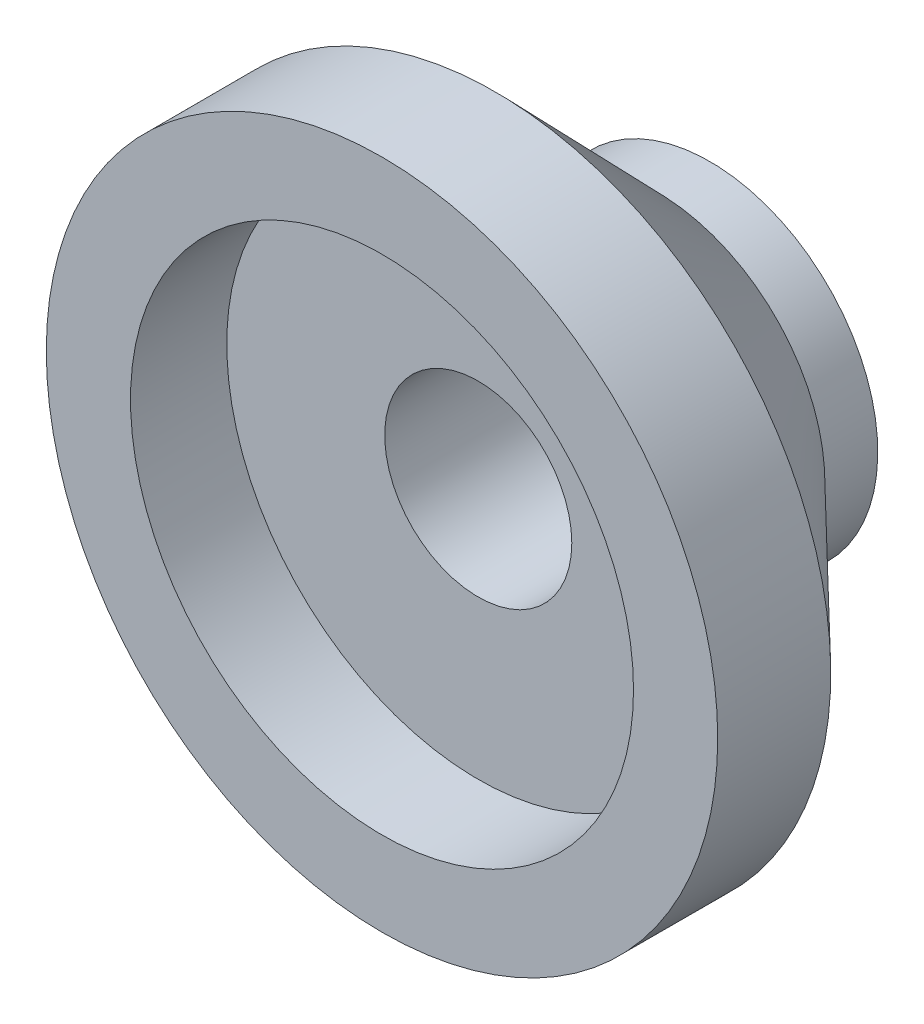
ISO-10303-21;
HEADER;
FILE_DESCRIPTION(('STEP AP214'),'2;1');
FILE_NAME('part.step','',(''),(''),'','','');
FILE_SCHEMA(('AUTOMOTIVE_DESIGN { 1 0 10303 214 1 1 1 1 }'));
ENDSEC;
DATA;
#1=APPLICATION_CONTEXT('core data for automotive mechanical design processes');
#2=APPLICATION_PROTOCOL_DEFINITION('international standard','automotive_design',2000,#1);
#3=PRODUCT_CONTEXT('',#1,'mechanical');
#4=PRODUCT('Part','Part','',(#3));
#5=PRODUCT_RELATED_PRODUCT_CATEGORY('part','',(#4));
#6=PRODUCT_DEFINITION_FORMATION('','',#4);
#7=PRODUCT_DEFINITION_CONTEXT('part definition',#1,'design');
#8=PRODUCT_DEFINITION('design','',#6,#7);
#9=PRODUCT_DEFINITION_SHAPE('','',#8);
#10=(LENGTH_UNIT() NAMED_UNIT(*) SI_UNIT(.MILLI.,.METRE.));
#11=(NAMED_UNIT(*) PLANE_ANGLE_UNIT() SI_UNIT($,.RADIAN.));
#12=(NAMED_UNIT(*) SI_UNIT($,.STERADIAN.) SOLID_ANGLE_UNIT());
#13=UNCERTAINTY_MEASURE_WITH_UNIT(LENGTH_MEASURE(1.E-05),#10,'distance_accuracy_value','');
#14=(GEOMETRIC_REPRESENTATION_CONTEXT(3) GLOBAL_UNCERTAINTY_ASSIGNED_CONTEXT((#13)) GLOBAL_UNIT_ASSIGNED_CONTEXT((#10,
#11,#12)) REPRESENTATION_CONTEXT('',''));
#15=CARTESIAN_POINT('',(0.,0.,0.));
#16=DIRECTION('',(0.,0.,1.));
#17=DIRECTION('',(1.,0.,0.));
#18=AXIS2_PLACEMENT_3D('',#15,#16,#17);
#19=CARTESIAN_POINT('',(0.,0.,3.641));
#20=DIRECTION('',(0.,0.,-1.));
#21=DIRECTION('',(-1.,0.,0.));
#22=AXIS2_PLACEMENT_3D('',#19,#20,#21);
#23=CYLINDRICAL_SURFACE('',#22,9.5143);
#24=CARTESIAN_POINT('',(0.,0.,0.));
#25=DIRECTION('',(0.,0.,1.));
#26=DIRECTION('',(1.,0.,0.));
#27=AXIS2_PLACEMENT_3D('',#24,#25,#26);
#28=CIRCLE('',#27,9.5143);
#29=CARTESIAN_POINT('',(9.5143,0.,0.));
#30=VERTEX_POINT('',#29);
#31=EDGE_CURVE('E18',#30,#30,#28,.T.);
#32=ORIENTED_EDGE('',*,*,#31,.F.);
#33=EDGE_LOOP('',(#32));
#34=FACE_BOUND('',#33,.T.);
#35=CARTESIAN_POINT('',(0.,0.,3.641));
#36=DIRECTION('',(0.,0.,1.));
#37=DIRECTION('',(1.,0.,0.));
#38=AXIS2_PLACEMENT_3D('',#35,#36,#37);
#39=CIRCLE('',#38,9.5143);
#40=CARTESIAN_POINT('',(9.5143,0.,3.641));
#41=VERTEX_POINT('',#40);
#42=EDGE_CURVE('E10',#41,#41,#39,.T.);
#43=ORIENTED_EDGE('',*,*,#42,.T.);
#44=EDGE_LOOP('',(#43));
#45=FACE_BOUND('',#44,.T.);
#46=ADVANCED_FACE('F15',(#34,#45),#23,.F.);
#47=CARTESIAN_POINT('',(0.,0.,3.641));
#48=DIRECTION('',(0.,0.,1.));
#49=DIRECTION('',(1.,0.,0.));
#50=AXIS2_PLACEMENT_3D('',#47,#48,#49);
#51=PLANE('',#50);
#52=ORIENTED_EDGE('',*,*,#42,.F.);
#53=EDGE_LOOP('',(#52));
#54=FACE_BOUND('',#53,.T.);
#55=CARTESIAN_POINT('',(0.,0.,3.641));
#56=DIRECTION('',(0.,0.,-1.));
#57=DIRECTION('',(1.,0.,0.));
#58=AXIS2_PLACEMENT_3D('',#55,#56,#57);
#59=CIRCLE('',#58,12.7);
#60=CARTESIAN_POINT('',(12.7,0.,3.641));
#61=VERTEX_POINT('',#60);
#62=EDGE_CURVE('E36',#61,#61,#59,.T.);
#63=ORIENTED_EDGE('',*,*,#62,.F.);
#64=EDGE_LOOP('',(#63));
#65=FACE_BOUND('',#64,.T.);
#66=ADVANCED_FACE('F81',(#54,#65),#51,.T.);
#67=CARTESIAN_POINT('',(0.,0.,0.));
#68=DIRECTION('',(0.,0.,-1.));
#69=DIRECTION('',(1.,0.,0.));
#70=AXIS2_PLACEMENT_3D('',#67,#68,#69);
#71=PLANE('',#70);
#72=CARTESIAN_POINT('',(1.0993810029003E-12,-1.00180280737661E-12,0.));
#73=DIRECTION('',(0.,0.,-1.));
#74=DIRECTION('',(1.,0.,0.));
#75=AXIS2_PLACEMENT_3D('',#72,#73,#74);
#76=CIRCLE('',#75,3.53891100499998);
#77=CARTESIAN_POINT('',(3.53891100500108,-1.00180280737661E-12,0.));
#78=VERTEX_POINT('',#77);
#79=EDGE_CURVE('E30',#78,#78,#76,.T.);
#80=ORIENTED_EDGE('',*,*,#79,.T.);
#81=EDGE_LOOP('',(#80));
#82=FACE_BOUND('',#81,.T.);
#83=ORIENTED_EDGE('',*,*,#31,.T.);
#84=EDGE_LOOP('',(#83));
#85=FACE_BOUND('',#84,.T.);
#86=ADVANCED_FACE('F75',(#82,#85),#71,.F.);
#87=CARTESIAN_POINT('',(1.0993810029003E-12,-1.00180280737661E-12,3.641));
#88=DIRECTION('',(0.,0.,-1.));
#89=DIRECTION('',(1.,0.,0.));
#90=AXIS2_PLACEMENT_3D('',#87,#88,#89);
#91=CYLINDRICAL_SURFACE('',#90,3.53891100499998);
#92=CARTESIAN_POINT('',(1.0993810029003E-12,-1.00180280737661E-12,-8.763));
#93=DIRECTION('',(0.,0.,-1.));
#94=DIRECTION('',(1.,0.,0.));
#95=AXIS2_PLACEMENT_3D('',#92,#93,#94);
#96=CIRCLE('',#95,3.53891100499998);
#97=CARTESIAN_POINT('',(3.53891100500108,-1.00180280737661E-12,-8.763));
#98=VERTEX_POINT('',#97);
#99=EDGE_CURVE('E32',#98,#98,#96,.T.);
#100=ORIENTED_EDGE('',*,*,#99,.T.);
#101=EDGE_LOOP('',(#100));
#102=FACE_BOUND('',#101,.T.);
#103=ORIENTED_EDGE('',*,*,#79,.F.);
#104=EDGE_LOOP('',(#103));
#105=FACE_BOUND('',#104,.T.);
#106=ADVANCED_FACE('F66',(#102,#105),#91,.F.);
#107=CARTESIAN_POINT('',(0.,0.,-8.763));
#108=DIRECTION('',(0.,0.,-1.));
#109=DIRECTION('',(1.,0.,0.));
#110=AXIS2_PLACEMENT_3D('',#107,#108,#109);
#111=PLANE('',#110);
#112=ORIENTED_EDGE('',*,*,#99,.F.);
#113=EDGE_LOOP('',(#112));
#114=FACE_BOUND('',#113,.T.);
#115=CARTESIAN_POINT('',(0.,0.,-8.763));
#116=DIRECTION('',(0.,0.,1.));
#117=DIRECTION('',(0.,-1.,0.));
#118=AXIS2_PLACEMENT_3D('',#115,#116,#117);
#119=CIRCLE('',#118,6.35);
#120=CARTESIAN_POINT('',(0.,-6.35,-8.763));
#121=VERTEX_POINT('',#120);
#122=EDGE_CURVE('E40',#121,#121,#119,.T.);
#123=ORIENTED_EDGE('',*,*,#122,.F.);
#124=EDGE_LOOP('',(#123));
#125=FACE_BOUND('',#124,.T.);
#126=ADVANCED_FACE('F64',(#114,#125),#111,.T.);
#127=CARTESIAN_POINT('',(0.,0.,0.));
#128=DIRECTION('',(0.,0.,1.));
#129=DIRECTION('',(-1.,0.,0.));
#130=AXIS2_PLACEMENT_3D('',#127,#128,#129);
#131=CYLINDRICAL_SURFACE('',#130,12.7);
#132=ORIENTED_EDGE('',*,*,#62,.T.);
#133=EDGE_LOOP('',(#132));
#134=FACE_BOUND('',#133,.T.);
#135=CARTESIAN_POINT('',(0.,0.,-0.635));
#136=DIRECTION('',(0.,0.,1.));
#137=DIRECTION('',(0.,-1.,0.));
#138=AXIS2_PLACEMENT_3D('',#135,#136,#137);
#139=CIRCLE('',#138,12.7);
#140=CARTESIAN_POINT('',(0.,-12.7,-0.635000000000002));
#141=VERTEX_POINT('',#140);
#142=EDGE_CURVE('E43',#141,#141,#139,.T.);
#143=ORIENTED_EDGE('',*,*,#142,.T.);
#144=EDGE_LOOP('',(#143));
#145=FACE_BOUND('',#144,.T.);
#146=ADVANCED_FACE('F60',(#134,#145),#131,.T.);
#147=CARTESIAN_POINT('',(0.,0.,1.8205));
#148=DIRECTION('',(0.,0.,1.));
#149=DIRECTION('',(0.,-1.,0.));
#150=AXIS2_PLACEMENT_3D('',#147,#148,#149);
#151=CYLINDRICAL_SURFACE('',#150,6.35);
#152=CARTESIAN_POINT('',(0.,0.,-6.763));
#153=DIRECTION('',(0.,0.,1.));
#154=DIRECTION('',(0.,-1.,0.));
#155=AXIS2_PLACEMENT_3D('',#152,#153,#154);
#156=CIRCLE('',#155,6.35);
#157=CARTESIAN_POINT('',(0.,-6.35,-6.763));
#158=VERTEX_POINT('',#157);
#159=EDGE_CURVE('E49',#158,#158,#156,.T.);
#160=ORIENTED_EDGE('',*,*,#159,.F.);
#161=EDGE_LOOP('',(#160));
#162=FACE_BOUND('',#161,.T.);
#163=ORIENTED_EDGE('',*,*,#122,.T.);
#164=EDGE_LOOP('',(#163));
#165=FACE_BOUND('',#164,.T.);
#166=ADVANCED_FACE('F57',(#162,#165),#151,.T.);
#167=CARTESIAN_POINT('',(0.,0.,-0.635));
#168=DIRECTION('',(0.,0.,1.));
#169=DIRECTION('',(0.,-1.,0.));
#170=AXIS2_PLACEMENT_3D('',#167,#168,#169);
#171=CONICAL_SURFACE('',#170,12.7,0.803187599298051);
#172=ORIENTED_EDGE('',*,*,#142,.F.);
#173=EDGE_LOOP('',(#172));
#174=FACE_BOUND('',#173,.T.);
#175=ORIENTED_EDGE('',*,*,#159,.T.);
#176=EDGE_LOOP('',(#175));
#177=FACE_BOUND('',#176,.T.);
#178=ADVANCED_FACE('F55',(#174,#177),#171,.T.);
#179=CLOSED_SHELL('',(#46,#66,#86,#106,#126,#146,#166,#178));
#180=MANIFOLD_SOLID_BREP('B1',#179);
#181=ADVANCED_BREP_SHAPE_REPRESENTATION('',(#18,#180),#14);
#182=SHAPE_DEFINITION_REPRESENTATION(#9,#181);
ENDSEC;
END-ISO-10303-21;
